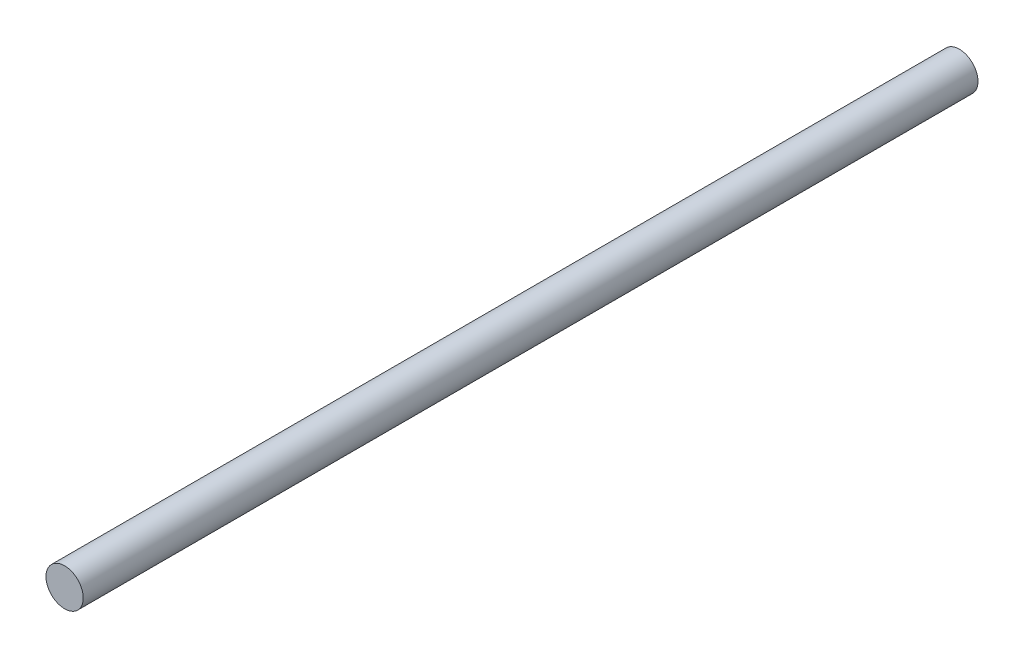
ISO-10303-21;
HEADER;
FILE_DESCRIPTION(('STEP AP214'),'2;1');
FILE_NAME('part.step','',(''),(''),'','','');
FILE_SCHEMA(('AUTOMOTIVE_DESIGN { 1 0 10303 214 1 1 1 1 }'));
ENDSEC;
DATA;
#1=APPLICATION_CONTEXT('core data for automotive mechanical design processes');
#2=APPLICATION_PROTOCOL_DEFINITION('international standard','automotive_design',2000,#1);
#3=PRODUCT_CONTEXT('',#1,'mechanical');
#4=PRODUCT('Part','Part','',(#3));
#5=PRODUCT_RELATED_PRODUCT_CATEGORY('part','',(#4));
#6=PRODUCT_DEFINITION_FORMATION('','',#4);
#7=PRODUCT_DEFINITION_CONTEXT('part definition',#1,'design');
#8=PRODUCT_DEFINITION('design','',#6,#7);
#9=PRODUCT_DEFINITION_SHAPE('','',#8);
#10=(LENGTH_UNIT() NAMED_UNIT(*) SI_UNIT(.MILLI.,.METRE.));
#11=(NAMED_UNIT(*) PLANE_ANGLE_UNIT() SI_UNIT($,.RADIAN.));
#12=(NAMED_UNIT(*) SI_UNIT($,.STERADIAN.) SOLID_ANGLE_UNIT());
#13=UNCERTAINTY_MEASURE_WITH_UNIT(LENGTH_MEASURE(1.E-05),#10,'distance_accuracy_value','');
#14=(GEOMETRIC_REPRESENTATION_CONTEXT(3) GLOBAL_UNCERTAINTY_ASSIGNED_CONTEXT((#13)) GLOBAL_UNIT_ASSIGNED_CONTEXT((#10,
#11,#12)) REPRESENTATION_CONTEXT('',''));
#15=CARTESIAN_POINT('',(0.,0.,0.));
#16=DIRECTION('',(0.,0.,1.));
#17=DIRECTION('',(1.,0.,0.));
#18=AXIS2_PLACEMENT_3D('',#15,#16,#17);
#19=CARTESIAN_POINT('',(0.,0.,58.));
#20=DIRECTION('',(0.,0.,-1.));
#21=DIRECTION('',(-1.,0.,0.));
#22=AXIS2_PLACEMENT_3D('',#19,#20,#21);
#23=CYLINDRICAL_SURFACE('',#22,2.);
#24=CARTESIAN_POINT('',(0.,0.,58.));
#25=DIRECTION('',(0.,0.,1.));
#26=DIRECTION('',(1.,0.,0.));
#27=AXIS2_PLACEMENT_3D('',#24,#25,#26);
#28=CIRCLE('',#27,2.);
#29=CARTESIAN_POINT('',(2.,0.,58.));
#30=VERTEX_POINT('',#29);
#31=EDGE_CURVE('E10',#30,#30,#28,.T.);
#32=ORIENTED_EDGE('',*,*,#31,.F.);
#33=EDGE_LOOP('',(#32));
#34=FACE_BOUND('',#33,.T.);
#35=CARTESIAN_POINT('',(0.,0.,-38.));
#36=DIRECTION('',(0.,0.,1.));
#37=DIRECTION('',(1.,0.,0.));
#38=AXIS2_PLACEMENT_3D('',#35,#36,#37);
#39=CIRCLE('',#38,2.);
#40=CARTESIAN_POINT('',(2.,0.,-38.));
#41=VERTEX_POINT('',#40);
#42=EDGE_CURVE('E39',#41,#41,#39,.T.);
#43=ORIENTED_EDGE('',*,*,#42,.T.);
#44=EDGE_LOOP('',(#43));
#45=FACE_BOUND('',#44,.T.);
#46=ADVANCED_FACE('F36',(#34,#45),#23,.T.);
#47=CARTESIAN_POINT('',(0.,0.,58.));
#48=DIRECTION('',(0.,0.,1.));
#49=DIRECTION('',(1.,0.,0.));
#50=AXIS2_PLACEMENT_3D('',#47,#48,#49);
#51=PLANE('',#50);
#52=ORIENTED_EDGE('',*,*,#31,.T.);
#53=EDGE_LOOP('',(#52));
#54=FACE_BOUND('',#53,.T.);
#55=ADVANCED_FACE('F53',(#54),#51,.T.);
#56=CARTESIAN_POINT('',(0.,0.,-38.));
#57=DIRECTION('',(0.,0.,1.));
#58=DIRECTION('',(1.,0.,0.));
#59=AXIS2_PLACEMENT_3D('',#56,#57,#58);
#60=PLANE('',#59);
#61=ORIENTED_EDGE('',*,*,#42,.F.);
#62=EDGE_LOOP('',(#61));
#63=FACE_BOUND('',#62,.T.);
#64=ADVANCED_FACE('F51',(#63),#60,.F.);
#65=CLOSED_SHELL('',(#46,#55,#64));
#66=MANIFOLD_SOLID_BREP('B2',#65);
#67=ADVANCED_BREP_SHAPE_REPRESENTATION('',(#18,#66),#14);
#68=SHAPE_DEFINITION_REPRESENTATION(#9,#67);
ENDSEC;
END-ISO-10303-21;
